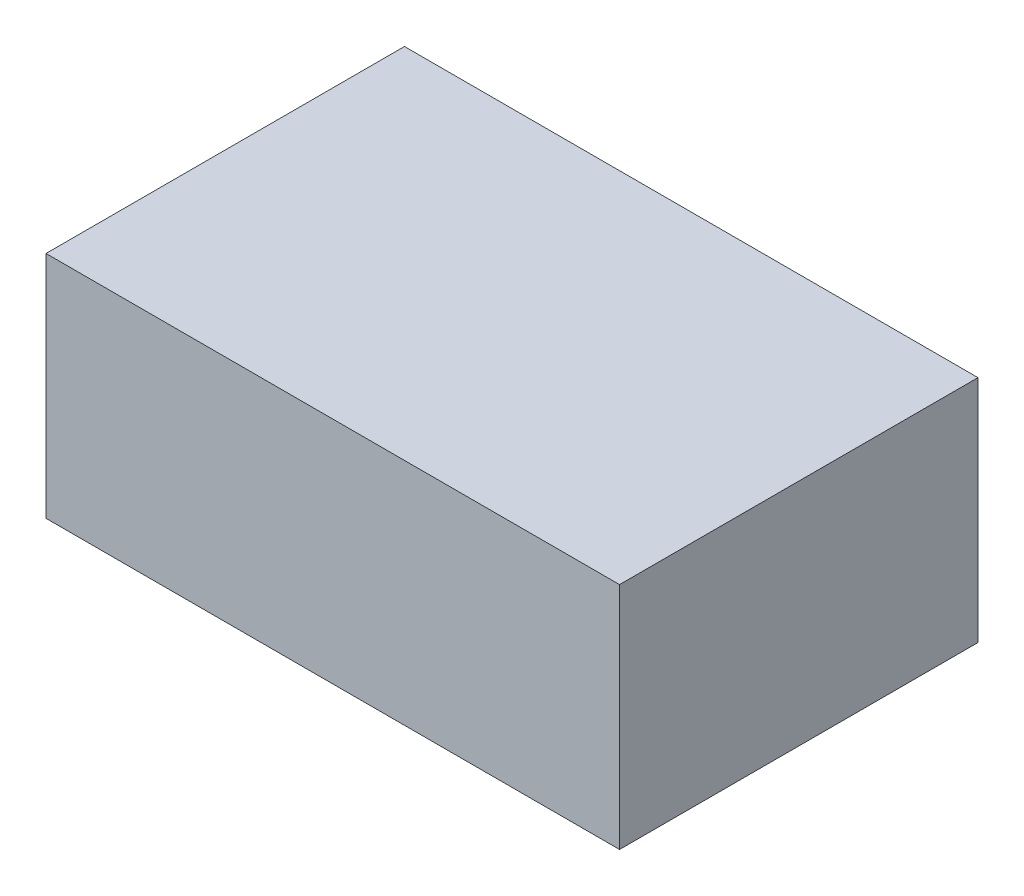
ISO-10303-21;
HEADER;
FILE_DESCRIPTION(('STEP AP214'),'2;1');
FILE_NAME('part.step','',(''),(''),'','','');
FILE_SCHEMA(('AUTOMOTIVE_DESIGN { 1 0 10303 214 1 1 1 1 }'));
ENDSEC;
DATA;
#1=APPLICATION_CONTEXT('core data for automotive mechanical design processes');
#2=APPLICATION_PROTOCOL_DEFINITION('international standard','automotive_design',2000,#1);
#3=PRODUCT_CONTEXT('',#1,'mechanical');
#4=PRODUCT('Part','Part','',(#3));
#5=PRODUCT_RELATED_PRODUCT_CATEGORY('part','',(#4));
#6=PRODUCT_DEFINITION_FORMATION('','',#4);
#7=PRODUCT_DEFINITION_CONTEXT('part definition',#1,'design');
#8=PRODUCT_DEFINITION('design','',#6,#7);
#9=PRODUCT_DEFINITION_SHAPE('','',#8);
#10=(LENGTH_UNIT() NAMED_UNIT(*) SI_UNIT(.MILLI.,.METRE.));
#11=(NAMED_UNIT(*) PLANE_ANGLE_UNIT() SI_UNIT($,.RADIAN.));
#12=(NAMED_UNIT(*) SI_UNIT($,.STERADIAN.) SOLID_ANGLE_UNIT());
#13=UNCERTAINTY_MEASURE_WITH_UNIT(LENGTH_MEASURE(1.E-05),#10,'distance_accuracy_value','');
#14=(GEOMETRIC_REPRESENTATION_CONTEXT(3) GLOBAL_UNCERTAINTY_ASSIGNED_CONTEXT((#13)) GLOBAL_UNIT_ASSIGNED_CONTEXT((#10,
#11,#12)) REPRESENTATION_CONTEXT('',''));
#15=CARTESIAN_POINT('',(0.,0.,0.));
#16=DIRECTION('',(0.,0.,1.));
#17=DIRECTION('',(1.,0.,0.));
#18=AXIS2_PLACEMENT_3D('',#15,#16,#17);
#19=CARTESIAN_POINT('',(0.,16.,0.));
#20=DIRECTION('',(1.,0.,0.));
#21=DIRECTION('',(0.,0.,-1.));
#22=AXIS2_PLACEMENT_3D('',#19,#20,#21);
#23=PLANE('',#22);
#24=DIRECTION('',(0.,0.,1.));
#25=VECTOR('',#24,1.);
#26=CARTESIAN_POINT('',(0.,0.,0.));
#27=LINE('',#26,#25);
#28=CARTESIAN_POINT('',(0.,0.,-25.));
#29=VERTEX_POINT('',#28);
#30=CARTESIAN_POINT('',(0.,0.,0.));
#31=VERTEX_POINT('',#30);
#32=EDGE_CURVE('E102',#29,#31,#27,.T.);
#33=ORIENTED_EDGE('',*,*,#32,.T.);
#34=DIRECTION('',(0.,-1.,0.));
#35=VECTOR('',#34,1.);
#36=CARTESIAN_POINT('',(0.,16.,0.));
#37=LINE('',#36,#35);
#38=CARTESIAN_POINT('',(0.,16.,0.));
#39=VERTEX_POINT('',#38);
#40=EDGE_CURVE('E11',#39,#31,#37,.T.);
#41=ORIENTED_EDGE('',*,*,#40,.F.);
#42=DIRECTION('',(0.,0.,1.));
#43=VECTOR('',#42,1.);
#44=CARTESIAN_POINT('',(0.,16.,0.));
#45=LINE('',#44,#43);
#46=CARTESIAN_POINT('',(0.,16.,-25.));
#47=VERTEX_POINT('',#46);
#48=EDGE_CURVE('E90',#47,#39,#45,.T.);
#49=ORIENTED_EDGE('',*,*,#48,.F.);
#50=DIRECTION('',(0.,-1.,0.));
#51=VECTOR('',#50,1.);
#52=CARTESIAN_POINT('',(0.,16.,-25.));
#53=LINE('',#52,#51);
#54=EDGE_CURVE('E98',#47,#29,#53,.T.);
#55=ORIENTED_EDGE('',*,*,#54,.T.);
#56=EDGE_LOOP('',(#33,#41,#49,#55));
#57=FACE_BOUND('',#56,.T.);
#58=ADVANCED_FACE('F39',(#57),#23,.F.);
#59=CARTESIAN_POINT('',(0.,16.,0.));
#60=DIRECTION('',(0.,0.,-1.));
#61=DIRECTION('',(-1.,0.,0.));
#62=AXIS2_PLACEMENT_3D('',#59,#60,#61);
#63=PLANE('',#62);
#64=DIRECTION('',(1.,0.,0.));
#65=VECTOR('',#64,1.);
#66=CARTESIAN_POINT('',(0.,0.,0.));
#67=LINE('',#66,#65);
#68=CARTESIAN_POINT('',(40.,0.,0.));
#69=VERTEX_POINT('',#68);
#70=EDGE_CURVE('E94',#31,#69,#67,.T.);
#71=ORIENTED_EDGE('',*,*,#70,.T.);
#72=DIRECTION('',(0.,-1.,0.));
#73=VECTOR('',#72,1.);
#74=CARTESIAN_POINT('',(40.,16.,0.));
#75=LINE('',#74,#73);
#76=CARTESIAN_POINT('',(40.,16.,0.));
#77=VERTEX_POINT('',#76);
#78=EDGE_CURVE('E47',#77,#69,#75,.T.);
#79=ORIENTED_EDGE('',*,*,#78,.F.);
#80=DIRECTION('',(1.,0.,0.));
#81=VECTOR('',#80,1.);
#82=CARTESIAN_POINT('',(0.,16.,0.));
#83=LINE('',#82,#81);
#84=EDGE_CURVE('E85',#39,#77,#83,.T.);
#85=ORIENTED_EDGE('',*,*,#84,.F.);
#86=ORIENTED_EDGE('',*,*,#40,.T.);
#87=EDGE_LOOP('',(#71,#79,#85,#86));
#88=FACE_BOUND('',#87,.T.);
#89=ADVANCED_FACE('F93',(#88),#63,.F.);
#90=CARTESIAN_POINT('',(40.,16.,0.));
#91=DIRECTION('',(-1.,0.,0.));
#92=DIRECTION('',(0.,0.,1.));
#93=AXIS2_PLACEMENT_3D('',#90,#91,#92);
#94=PLANE('',#93);
#95=DIRECTION('',(0.,0.,-1.));
#96=VECTOR('',#95,1.);
#97=CARTESIAN_POINT('',(40.,0.,0.));
#98=LINE('',#97,#96);
#99=CARTESIAN_POINT('',(40.,0.,-25.));
#100=VERTEX_POINT('',#99);
#101=EDGE_CURVE('E72',#69,#100,#98,.T.);
#102=ORIENTED_EDGE('',*,*,#101,.T.);
#103=DIRECTION('',(0.,-1.,0.));
#104=VECTOR('',#103,1.);
#105=CARTESIAN_POINT('',(40.,16.,-25.));
#106=LINE('',#105,#104);
#107=CARTESIAN_POINT('',(40.,16.,-25.));
#108=VERTEX_POINT('',#107);
#109=EDGE_CURVE('E95',#108,#100,#106,.T.);
#110=ORIENTED_EDGE('',*,*,#109,.F.);
#111=DIRECTION('',(0.,0.,-1.));
#112=VECTOR('',#111,1.);
#113=CARTESIAN_POINT('',(40.,16.,0.));
#114=LINE('',#113,#112);
#115=EDGE_CURVE('E88',#77,#108,#114,.T.);
#116=ORIENTED_EDGE('',*,*,#115,.F.);
#117=ORIENTED_EDGE('',*,*,#78,.T.);
#118=EDGE_LOOP('',(#102,#110,#116,#117));
#119=FACE_BOUND('',#118,.T.);
#120=ADVANCED_FACE('F96',(#119),#94,.F.);
#121=CARTESIAN_POINT('',(0.,16.,-25.));
#122=DIRECTION('',(0.,0.,1.));
#123=DIRECTION('',(1.,0.,0.));
#124=AXIS2_PLACEMENT_3D('',#121,#122,#123);
#125=PLANE('',#124);
#126=DIRECTION('',(-1.,0.,0.));
#127=VECTOR('',#126,1.);
#128=CARTESIAN_POINT('',(0.,0.,-25.));
#129=LINE('',#128,#127);
#130=EDGE_CURVE('E78',#100,#29,#129,.T.);
#131=ORIENTED_EDGE('',*,*,#130,.T.);
#132=ORIENTED_EDGE('',*,*,#54,.F.);
#133=DIRECTION('',(-1.,0.,0.));
#134=VECTOR('',#133,1.);
#135=CARTESIAN_POINT('',(0.,16.,-25.));
#136=LINE('',#135,#134);
#137=EDGE_CURVE('E55',#108,#47,#136,.T.);
#138=ORIENTED_EDGE('',*,*,#137,.F.);
#139=ORIENTED_EDGE('',*,*,#109,.T.);
#140=EDGE_LOOP('',(#131,#132,#138,#139));
#141=FACE_BOUND('',#140,.T.);
#142=ADVANCED_FACE('F109',(#141),#125,.F.);
#143=CARTESIAN_POINT('',(0.,16.,0.));
#144=DIRECTION('',(0.,-1.,0.));
#145=DIRECTION('',(0.,0.,-1.));
#146=AXIS2_PLACEMENT_3D('',#143,#144,#145);
#147=PLANE('',#146);
#148=ORIENTED_EDGE('',*,*,#48,.T.);
#149=ORIENTED_EDGE('',*,*,#84,.T.);
#150=ORIENTED_EDGE('',*,*,#115,.T.);
#151=ORIENTED_EDGE('',*,*,#137,.T.);
#152=EDGE_LOOP('',(#148,#149,#150,#151));
#153=FACE_BOUND('',#152,.T.);
#154=ADVANCED_FACE('F86',(#153),#147,.F.);
#155=CARTESIAN_POINT('',(0.,0.,0.));
#156=DIRECTION('',(0.,-1.,0.));
#157=DIRECTION('',(0.,0.,-1.));
#158=AXIS2_PLACEMENT_3D('',#155,#156,#157);
#159=PLANE('',#158);
#160=ORIENTED_EDGE('',*,*,#32,.F.);
#161=ORIENTED_EDGE('',*,*,#130,.F.);
#162=ORIENTED_EDGE('',*,*,#101,.F.);
#163=ORIENTED_EDGE('',*,*,#70,.F.);
#164=EDGE_LOOP('',(#160,#161,#162,#163));
#165=FACE_BOUND('',#164,.T.);
#166=ADVANCED_FACE('F112',(#165),#159,.T.);
#167=CLOSED_SHELL('',(#58,#89,#120,#142,#154,#166));
#168=MANIFOLD_SOLID_BREP('B2',#167);
#169=ADVANCED_BREP_SHAPE_REPRESENTATION('',(#18,#168),#14);
#170=SHAPE_DEFINITION_REPRESENTATION(#9,#169);
ENDSEC;
END-ISO-10303-21;
